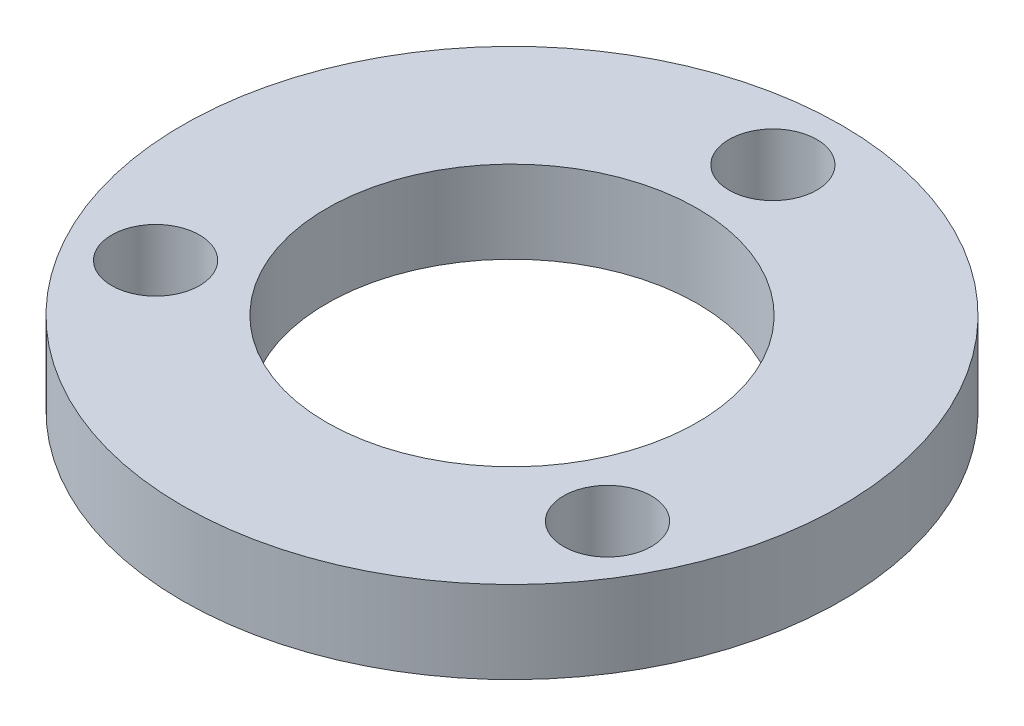
ISO-10303-21;
HEADER;
FILE_DESCRIPTION(('STEP AP214'),'2;1');
FILE_NAME('part.step','',(''),(''),'','','');
FILE_SCHEMA(('AUTOMOTIVE_DESIGN { 1 0 10303 214 1 1 1 1 }'));
ENDSEC;
DATA;
#1=APPLICATION_CONTEXT('core data for automotive mechanical design processes');
#2=APPLICATION_PROTOCOL_DEFINITION('international standard','automotive_design',2000,#1);
#3=PRODUCT_CONTEXT('',#1,'mechanical');
#4=PRODUCT('Part','Part','',(#3));
#5=PRODUCT_RELATED_PRODUCT_CATEGORY('part','',(#4));
#6=PRODUCT_DEFINITION_FORMATION('','',#4);
#7=PRODUCT_DEFINITION_CONTEXT('part definition',#1,'design');
#8=PRODUCT_DEFINITION('design','',#6,#7);
#9=PRODUCT_DEFINITION_SHAPE('','',#8);
#10=(LENGTH_UNIT() NAMED_UNIT(*) SI_UNIT(.MILLI.,.METRE.));
#11=(NAMED_UNIT(*) PLANE_ANGLE_UNIT() SI_UNIT($,.RADIAN.));
#12=(NAMED_UNIT(*) SI_UNIT($,.STERADIAN.) SOLID_ANGLE_UNIT());
#13=UNCERTAINTY_MEASURE_WITH_UNIT(LENGTH_MEASURE(1.E-05),#10,'distance_accuracy_value','');
#14=(GEOMETRIC_REPRESENTATION_CONTEXT(3) GLOBAL_UNCERTAINTY_ASSIGNED_CONTEXT((#13)) GLOBAL_UNIT_ASSIGNED_CONTEXT((#10,
#11,#12)) REPRESENTATION_CONTEXT('',''));
#15=CARTESIAN_POINT('',(0.,0.,0.));
#16=DIRECTION('',(0.,0.,1.));
#17=DIRECTION('',(1.,0.,0.));
#18=AXIS2_PLACEMENT_3D('',#15,#16,#17);
#19=CARTESIAN_POINT('',(0.,3.,0.));
#20=DIRECTION('',(0.,1.,0.));
#21=DIRECTION('',(0.,0.,1.));
#22=AXIS2_PLACEMENT_3D('',#19,#20,#21);
#23=PLANE('',#22);
#24=CARTESIAN_POINT('',(8.22724133595277,3.,4.74999999999965));
#25=DIRECTION('',(0.,1.,0.));
#26=DIRECTION('',(0.,0.,1.));
#27=AXIS2_PLACEMENT_3D('',#24,#25,#26);
#28=CIRCLE('',#27,1.6);
#29=CARTESIAN_POINT('',(8.22724133595277,3.,6.34999999999965));
#30=VERTEX_POINT('',#29);
#31=EDGE_CURVE('E57',#30,#30,#28,.T.);
#32=ORIENTED_EDGE('',*,*,#31,.F.);
#33=EDGE_LOOP('',(#32));
#34=FACE_BOUND('',#33,.T.);
#35=CARTESIAN_POINT('',(0.,3.,-9.5));
#36=DIRECTION('',(0.,1.,0.));
#37=DIRECTION('',(0.,0.,1.));
#38=AXIS2_PLACEMENT_3D('',#35,#36,#37);
#39=CIRCLE('',#38,1.6);
#40=CARTESIAN_POINT('',(0.,3.,-7.9));
#41=VERTEX_POINT('',#40);
#42=EDGE_CURVE('E46',#41,#41,#39,.T.);
#43=ORIENTED_EDGE('',*,*,#42,.F.);
#44=EDGE_LOOP('',(#43));
#45=FACE_BOUND('',#44,.T.);
#46=CARTESIAN_POINT('',(0.,3.,0.));
#47=DIRECTION('',(0.,1.,0.));
#48=DIRECTION('',(0.,0.,1.));
#49=AXIS2_PLACEMENT_3D('',#46,#47,#48);
#50=CIRCLE('',#49,12.);
#51=CARTESIAN_POINT('',(0.,3.,12.));
#52=VERTEX_POINT('',#51);
#53=EDGE_CURVE('E10',#52,#52,#50,.T.);
#54=ORIENTED_EDGE('',*,*,#53,.T.);
#55=EDGE_LOOP('',(#54));
#56=FACE_BOUND('',#55,.T.);
#57=CARTESIAN_POINT('',(0.,3.,0.));
#58=DIRECTION('',(0.,1.,0.));
#59=DIRECTION('',(0.,0.,1.));
#60=AXIS2_PLACEMENT_3D('',#57,#58,#59);
#61=CIRCLE('',#60,6.75);
#62=CARTESIAN_POINT('',(0.,3.,6.75));
#63=VERTEX_POINT('',#62);
#64=EDGE_CURVE('E51',#63,#63,#61,.T.);
#65=ORIENTED_EDGE('',*,*,#64,.F.);
#66=EDGE_LOOP('',(#65));
#67=FACE_BOUND('',#66,.T.);
#68=CARTESIAN_POINT('',(-8.22724133595156,3.,4.75000000000035));
#69=DIRECTION('',(0.,1.,0.));
#70=DIRECTION('',(0.,0.,1.));
#71=AXIS2_PLACEMENT_3D('',#68,#69,#70);
#72=CIRCLE('',#71,1.6);
#73=CARTESIAN_POINT('',(-8.22724133595156,3.,6.35000000000035));
#74=VERTEX_POINT('',#73);
#75=EDGE_CURVE('E63',#74,#74,#72,.T.);
#76=ORIENTED_EDGE('',*,*,#75,.F.);
#77=EDGE_LOOP('',(#76));
#78=FACE_BOUND('',#77,.T.);
#79=ADVANCED_FACE('F35',(#34,#45,#56,#67,#78),#23,.T.);
#80=CARTESIAN_POINT('',(0.,0.,0.));
#81=DIRECTION('',(0.,1.,0.));
#82=DIRECTION('',(0.,0.,1.));
#83=AXIS2_PLACEMENT_3D('',#80,#81,#82);
#84=PLANE('',#83);
#85=CARTESIAN_POINT('',(8.22724133595277,0.,4.74999999999965));
#86=DIRECTION('',(0.,1.,0.));
#87=DIRECTION('',(0.,0.,1.));
#88=AXIS2_PLACEMENT_3D('',#85,#86,#87);
#89=CIRCLE('',#88,1.6);
#90=CARTESIAN_POINT('',(8.22724133595277,0.,6.34999999999965));
#91=VERTEX_POINT('',#90);
#92=EDGE_CURVE('E60',#91,#91,#89,.T.);
#93=ORIENTED_EDGE('',*,*,#92,.T.);
#94=EDGE_LOOP('',(#93));
#95=FACE_BOUND('',#94,.T.);
#96=CARTESIAN_POINT('',(0.,0.,-9.5));
#97=DIRECTION('',(0.,1.,0.));
#98=DIRECTION('',(0.,0.,1.));
#99=AXIS2_PLACEMENT_3D('',#96,#97,#98);
#100=CIRCLE('',#99,1.6);
#101=CARTESIAN_POINT('',(0.,0.,-7.9));
#102=VERTEX_POINT('',#101);
#103=EDGE_CURVE('E48',#102,#102,#100,.T.);
#104=ORIENTED_EDGE('',*,*,#103,.T.);
#105=EDGE_LOOP('',(#104));
#106=FACE_BOUND('',#105,.T.);
#107=CARTESIAN_POINT('',(0.,0.,0.));
#108=DIRECTION('',(0.,1.,0.));
#109=DIRECTION('',(0.,0.,1.));
#110=AXIS2_PLACEMENT_3D('',#107,#108,#109);
#111=CIRCLE('',#110,12.);
#112=CARTESIAN_POINT('',(0.,0.,12.));
#113=VERTEX_POINT('',#112);
#114=EDGE_CURVE('E39',#113,#113,#111,.T.);
#115=ORIENTED_EDGE('',*,*,#114,.F.);
#116=EDGE_LOOP('',(#115));
#117=FACE_BOUND('',#116,.T.);
#118=CARTESIAN_POINT('',(0.,0.,0.));
#119=DIRECTION('',(0.,1.,0.));
#120=DIRECTION('',(0.,0.,1.));
#121=AXIS2_PLACEMENT_3D('',#118,#119,#120);
#122=CIRCLE('',#121,6.75);
#123=CARTESIAN_POINT('',(0.,0.,6.75));
#124=VERTEX_POINT('',#123);
#125=EDGE_CURVE('E54',#124,#124,#122,.T.);
#126=ORIENTED_EDGE('',*,*,#125,.T.);
#127=EDGE_LOOP('',(#126));
#128=FACE_BOUND('',#127,.T.);
#129=CARTESIAN_POINT('',(-8.22724133595156,0.,4.75000000000035));
#130=DIRECTION('',(0.,1.,0.));
#131=DIRECTION('',(0.,0.,1.));
#132=AXIS2_PLACEMENT_3D('',#129,#130,#131);
#133=CIRCLE('',#132,1.6);
#134=CARTESIAN_POINT('',(-8.22724133595156,0.,6.35000000000035));
#135=VERTEX_POINT('',#134);
#136=EDGE_CURVE('E66',#135,#135,#133,.T.);
#137=ORIENTED_EDGE('',*,*,#136,.T.);
#138=EDGE_LOOP('',(#137));
#139=FACE_BOUND('',#138,.T.);
#140=ADVANCED_FACE('F76',(#95,#106,#117,#128,#139),#84,.F.);
#141=CARTESIAN_POINT('',(0.,3.,0.));
#142=DIRECTION('',(0.,-1.,0.));
#143=DIRECTION('',(0.,0.,-1.));
#144=AXIS2_PLACEMENT_3D('',#141,#142,#143);
#145=CYLINDRICAL_SURFACE('',#144,12.);
#146=ORIENTED_EDGE('',*,*,#53,.F.);
#147=EDGE_LOOP('',(#146));
#148=FACE_BOUND('',#147,.T.);
#149=ORIENTED_EDGE('',*,*,#114,.T.);
#150=EDGE_LOOP('',(#149));
#151=FACE_BOUND('',#150,.T.);
#152=ADVANCED_FACE('F37',(#148,#151),#145,.T.);
#153=CARTESIAN_POINT('',(0.,3.,-9.5));
#154=DIRECTION('',(0.,-1.,0.));
#155=DIRECTION('',(0.,0.,-1.));
#156=AXIS2_PLACEMENT_3D('',#153,#154,#155);
#157=CYLINDRICAL_SURFACE('',#156,1.6);
#158=ORIENTED_EDGE('',*,*,#42,.T.);
#159=EDGE_LOOP('',(#158));
#160=FACE_BOUND('',#159,.T.);
#161=ORIENTED_EDGE('',*,*,#103,.F.);
#162=EDGE_LOOP('',(#161));
#163=FACE_BOUND('',#162,.T.);
#164=ADVANCED_FACE('F86',(#160,#163),#157,.F.);
#165=CARTESIAN_POINT('',(0.,3.,0.));
#166=DIRECTION('',(0.,-1.,0.));
#167=DIRECTION('',(0.,0.,-1.));
#168=AXIS2_PLACEMENT_3D('',#165,#166,#167);
#169=CYLINDRICAL_SURFACE('',#168,6.75);
#170=ORIENTED_EDGE('',*,*,#64,.T.);
#171=EDGE_LOOP('',(#170));
#172=FACE_BOUND('',#171,.T.);
#173=ORIENTED_EDGE('',*,*,#125,.F.);
#174=EDGE_LOOP('',(#173));
#175=FACE_BOUND('',#174,.T.);
#176=ADVANCED_FACE('F89',(#172,#175),#169,.F.);
#177=CARTESIAN_POINT('',(8.22724133595277,3.,4.74999999999965));
#178=DIRECTION('',(0.,-1.,0.));
#179=DIRECTION('',(0.,0.,-1.));
#180=AXIS2_PLACEMENT_3D('',#177,#178,#179);
#181=CYLINDRICAL_SURFACE('',#180,1.6);
#182=ORIENTED_EDGE('',*,*,#31,.T.);
#183=EDGE_LOOP('',(#182));
#184=FACE_BOUND('',#183,.T.);
#185=ORIENTED_EDGE('',*,*,#92,.F.);
#186=EDGE_LOOP('',(#185));
#187=FACE_BOUND('',#186,.T.);
#188=ADVANCED_FACE('F93',(#184,#187),#181,.F.);
#189=CARTESIAN_POINT('',(-8.22724133595156,3.,4.75000000000035));
#190=DIRECTION('',(0.,-1.,0.));
#191=DIRECTION('',(0.,0.,-1.));
#192=AXIS2_PLACEMENT_3D('',#189,#190,#191);
#193=CYLINDRICAL_SURFACE('',#192,1.6);
#194=ORIENTED_EDGE('',*,*,#75,.T.);
#195=EDGE_LOOP('',(#194));
#196=FACE_BOUND('',#195,.T.);
#197=ORIENTED_EDGE('',*,*,#136,.F.);
#198=EDGE_LOOP('',(#197));
#199=FACE_BOUND('',#198,.T.);
#200=ADVANCED_FACE('F72',(#196,#199),#193,.F.);
#201=CLOSED_SHELL('',(#79,#140,#152,#164,#176,#188,#200));
#202=MANIFOLD_SOLID_BREP('B2',#201);
#203=ADVANCED_BREP_SHAPE_REPRESENTATION('',(#18,#202),#14);
#204=SHAPE_DEFINITION_REPRESENTATION(#9,#203);
ENDSEC;
END-ISO-10303-21;
